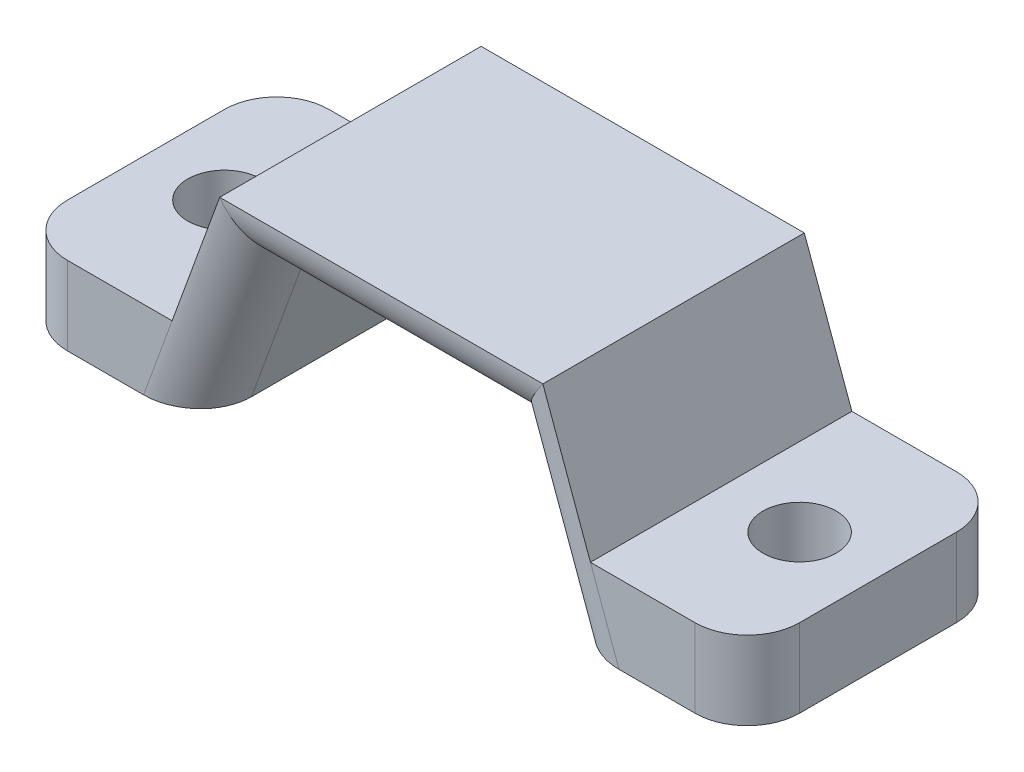
ISO-10303-21;
HEADER;
FILE_DESCRIPTION(('STEP AP214'),'2;1');
FILE_NAME('part.step','',(''),(''),'','','');
FILE_SCHEMA(('AUTOMOTIVE_DESIGN { 1 0 10303 214 1 1 1 1 }'));
ENDSEC;
DATA;
#1=APPLICATION_CONTEXT('core data for automotive mechanical design processes');
#2=APPLICATION_PROTOCOL_DEFINITION('international standard','automotive_design',2000,#1);
#3=PRODUCT_CONTEXT('',#1,'mechanical');
#4=PRODUCT('Part','Part','',(#3));
#5=PRODUCT_RELATED_PRODUCT_CATEGORY('part','',(#4));
#6=PRODUCT_DEFINITION_FORMATION('','',#4);
#7=PRODUCT_DEFINITION_CONTEXT('part definition',#1,'design');
#8=PRODUCT_DEFINITION('design','',#6,#7);
#9=PRODUCT_DEFINITION_SHAPE('','',#8);
#10=(LENGTH_UNIT() NAMED_UNIT(*) SI_UNIT(.MILLI.,.METRE.));
#11=(NAMED_UNIT(*) PLANE_ANGLE_UNIT() SI_UNIT($,.RADIAN.));
#12=(NAMED_UNIT(*) SI_UNIT($,.STERADIAN.) SOLID_ANGLE_UNIT());
#13=UNCERTAINTY_MEASURE_WITH_UNIT(LENGTH_MEASURE(1.E-05),#10,'distance_accuracy_value','');
#14=(GEOMETRIC_REPRESENTATION_CONTEXT(3) GLOBAL_UNCERTAINTY_ASSIGNED_CONTEXT((#13)) GLOBAL_UNIT_ASSIGNED_CONTEXT((#10,
#11,#12)) REPRESENTATION_CONTEXT('',''));
#15=CARTESIAN_POINT('',(0.,0.,0.));
#16=DIRECTION('',(0.,0.,1.));
#17=DIRECTION('',(1.,0.,0.));
#18=AXIS2_PLACEMENT_3D('',#15,#16,#17);
#19=CARTESIAN_POINT('',(0.,0.,5.));
#20=DIRECTION('',(0.,0.,1.));
#21=DIRECTION('',(1.,0.,0.));
#22=AXIS2_PLACEMENT_3D('',#19,#20,#21);
#23=PLANE('',#22);
#24=DIRECTION('',(1.,0.,0.));
#25=VECTOR('',#24,1.);
#26=CARTESIAN_POINT('',(6.96355515784677,0.,5.));
#27=LINE('',#26,#25);
#28=CARTESIAN_POINT('',(9.09191070279859,0.,5.));
#29=VERTEX_POINT('',#28);
#30=CARTESIAN_POINT('',(12.,0.,5.));
#31=VERTEX_POINT('',#30);
#32=EDGE_CURVE('E175',#29,#31,#27,.T.);
#33=ORIENTED_EDGE('',*,*,#32,.T.);
#34=DIRECTION('',(0.,1.,0.));
#35=VECTOR('',#34,1.);
#36=CARTESIAN_POINT('',(12.,3.,5.));
#37=LINE('',#36,#35);
#38=CARTESIAN_POINT('',(12.,3.,5.));
#39=VERTEX_POINT('',#38);
#40=EDGE_CURVE('E171',#31,#39,#37,.T.);
#41=ORIENTED_EDGE('',*,*,#40,.T.);
#42=DIRECTION('',(-1.,0.,0.));
#43=VECTOR('',#42,1.);
#44=CARTESIAN_POINT('',(14.,3.,5.));
#45=LINE('',#44,#43);
#46=CARTESIAN_POINT('',(8.,3.,5.));
#47=VERTEX_POINT('',#46);
#48=EDGE_CURVE('E165',#39,#47,#45,.T.);
#49=ORIENTED_EDGE('',*,*,#48,.T.);
#50=DIRECTION('',(0.342020143325666,-0.93969262078591,0.));
#51=VECTOR('',#50,1.);
#52=CARTESIAN_POINT('',(8.84294039941859,0.684040286651331,5.));
#53=LINE('',#52,#51);
#54=EDGE_CURVE('E168',#47,#29,#53,.T.);
#55=ORIENTED_EDGE('',*,*,#54,.T.);
#56=EDGE_LOOP('',(#33,#41,#49,#55));
#57=FACE_BOUND('',#56,.T.);
#58=ADVANCED_FACE('F39',(#57),#23,.T.);
#59=CARTESIAN_POINT('',(0.,0.,-5.));
#60=DIRECTION('',(0.,0.,1.));
#61=DIRECTION('',(1.,0.,0.));
#62=AXIS2_PLACEMENT_3D('',#59,#60,#61);
#63=PLANE('',#62);
#64=DIRECTION('',(1.,0.,0.));
#65=VECTOR('',#64,1.);
#66=CARTESIAN_POINT('',(-14.,0.,-5.));
#67=LINE('',#66,#65);
#68=CARTESIAN_POINT('',(-12.,0.,-5.));
#69=VERTEX_POINT('',#68);
#70=CARTESIAN_POINT('',(-9.0919107027986,0.,-5.));
#71=VERTEX_POINT('',#70);
#72=EDGE_CURVE('E214',#69,#71,#67,.T.);
#73=ORIENTED_EDGE('',*,*,#72,.F.);
#74=DIRECTION('',(0.,-1.,0.));
#75=VECTOR('',#74,1.);
#76=CARTESIAN_POINT('',(-12.,0.,-5.));
#77=LINE('',#76,#75);
#78=CARTESIAN_POINT('',(-12.,3.,-5.));
#79=VERTEX_POINT('',#78);
#80=EDGE_CURVE('E11',#69,#79,#77,.F.);
#81=ORIENTED_EDGE('',*,*,#80,.T.);
#82=DIRECTION('',(-1.,0.,0.));
#83=VECTOR('',#82,1.);
#84=CARTESIAN_POINT('',(-8.,3.,-5.));
#85=LINE('',#84,#83);
#86=CARTESIAN_POINT('',(-8.,3.,-5.));
#87=VERTEX_POINT('',#86);
#88=EDGE_CURVE('E227',#87,#79,#85,.T.);
#89=ORIENTED_EDGE('',*,*,#88,.F.);
#90=DIRECTION('',(0.342020143325666,0.93969262078591,0.));
#91=VECTOR('',#90,1.);
#92=CARTESIAN_POINT('',(-8.02835918700573,2.92208377406766,-5.));
#93=LINE('',#92,#91);
#94=EDGE_CURVE('E265',#87,#71,#93,.F.);
#95=ORIENTED_EDGE('',*,*,#94,.T.);
#96=EDGE_LOOP('',(#73,#81,#89,#95));
#97=FACE_BOUND('',#96,.T.);
#98=ADVANCED_FACE('F343',(#97),#63,.F.);
#99=CARTESIAN_POINT('',(-14.,3.,5.));
#100=DIRECTION('',(1.,0.,0.));
#101=DIRECTION('',(0.,0.,-1.));
#102=AXIS2_PLACEMENT_3D('',#99,#100,#101);
#103=PLANE('',#102);
#104=DIRECTION('',(0.,0.,-1.));
#105=VECTOR('',#104,1.);
#106=CARTESIAN_POINT('',(-14.,0.,5.));
#107=LINE('',#106,#105);
#108=CARTESIAN_POINT('',(-14.,0.,3.));
#109=VERTEX_POINT('',#108);
#110=CARTESIAN_POINT('',(-14.,0.,-3.));
#111=VERTEX_POINT('',#110);
#112=EDGE_CURVE('E255',#109,#111,#107,.T.);
#113=ORIENTED_EDGE('',*,*,#112,.F.);
#114=DIRECTION('',(0.,-1.,0.));
#115=VECTOR('',#114,1.);
#116=CARTESIAN_POINT('',(-14.,3.,3.));
#117=LINE('',#116,#115);
#118=CARTESIAN_POINT('',(-14.,3.,3.));
#119=VERTEX_POINT('',#118);
#120=EDGE_CURVE('E322',#109,#119,#117,.F.);
#121=ORIENTED_EDGE('',*,*,#120,.T.);
#122=DIRECTION('',(0.,0.,-1.));
#123=VECTOR('',#122,1.);
#124=CARTESIAN_POINT('',(-14.,3.,5.));
#125=LINE('',#124,#123);
#126=CARTESIAN_POINT('',(-14.,3.,-3.));
#127=VERTEX_POINT('',#126);
#128=EDGE_CURVE('E213',#119,#127,#125,.T.);
#129=ORIENTED_EDGE('',*,*,#128,.T.);
#130=DIRECTION('',(0.,-1.,0.));
#131=VECTOR('',#130,1.);
#132=CARTESIAN_POINT('',(-14.,3.,-3.));
#133=LINE('',#132,#131);
#134=EDGE_CURVE('E319',#127,#111,#133,.T.);
#135=ORIENTED_EDGE('',*,*,#134,.T.);
#136=EDGE_LOOP('',(#113,#121,#129,#135));
#137=FACE_BOUND('',#136,.T.);
#138=ADVANCED_FACE('F340',(#137),#103,.F.);
#139=CARTESIAN_POINT('',(-14.,0.,5.));
#140=DIRECTION('',(0.,1.,0.));
#141=DIRECTION('',(-1.,0.,0.));
#142=AXIS2_PLACEMENT_3D('',#139,#140,#141);
#143=PLANE('',#142);
#144=CARTESIAN_POINT('',(-11.,0.,0.));
#145=DIRECTION('',(0.,-1.,0.));
#146=DIRECTION('',(0.,0.,-1.));
#147=AXIS2_PLACEMENT_3D('',#144,#145,#146);
#148=CIRCLE('',#147,1.4);
#149=CARTESIAN_POINT('',(-11.,0.,-1.4));
#150=VERTEX_POINT('',#149);
#151=EDGE_CURVE('E408',#150,#150,#148,.T.);
#152=ORIENTED_EDGE('',*,*,#151,.F.);
#153=EDGE_LOOP('',(#152));
#154=FACE_BOUND('',#153,.T.);
#155=DIRECTION('',(1.,0.,0.));
#156=VECTOR('',#155,1.);
#157=CARTESIAN_POINT('',(-14.,0.,5.));
#158=LINE('',#157,#156);
#159=CARTESIAN_POINT('',(-12.,0.,5.));
#160=VERTEX_POINT('',#159);
#161=CARTESIAN_POINT('',(-9.0919107027986,0.,5.));
#162=VERTEX_POINT('',#161);
#163=EDGE_CURVE('E229',#160,#162,#158,.T.);
#164=ORIENTED_EDGE('',*,*,#163,.F.);
#165=CARTESIAN_POINT('',(-12.,0.,3.));
#166=DIRECTION('',(0.,1.,0.));
#167=DIRECTION('',(-1.,0.,0.));
#168=AXIS2_PLACEMENT_3D('',#165,#166,#167);
#169=CIRCLE('',#168,2.);
#170=EDGE_CURVE('E317',#160,#109,#169,.F.);
#171=ORIENTED_EDGE('',*,*,#170,.T.);
#172=ORIENTED_EDGE('',*,*,#112,.T.);
#173=CARTESIAN_POINT('',(-12.,0.,-3.));
#174=DIRECTION('',(0.,1.,0.));
#175=DIRECTION('',(-1.,0.,0.));
#176=AXIS2_PLACEMENT_3D('',#173,#174,#175);
#177=CIRCLE('',#176,2.);
#178=EDGE_CURVE('E315',#111,#69,#177,.F.);
#179=ORIENTED_EDGE('',*,*,#178,.T.);
#180=ORIENTED_EDGE('',*,*,#72,.T.);
#181=CARTESIAN_POINT('',(-9.0919107027986,0.,-3.));
#182=DIRECTION('',(0.,1.,0.));
#183=DIRECTION('',(1.,0.,0.));
#184=AXIS2_PLACEMENT_3D('',#181,#182,#183);
#185=ELLIPSE('',#184,2.12835554495182,2.);
#186=CARTESIAN_POINT('',(-6.96355515784677,0.,-3.));
#187=VERTEX_POINT('',#186);
#188=EDGE_CURVE('E271',#71,#187,#185,.F.);
#189=ORIENTED_EDGE('',*,*,#188,.T.);
#190=DIRECTION('',(0.,0.,-1.));
#191=VECTOR('',#190,1.);
#192=CARTESIAN_POINT('',(-6.96355515784677,0.,5.));
#193=LINE('',#192,#191);
#194=CARTESIAN_POINT('',(-6.96355515784677,0.,3.));
#195=VERTEX_POINT('',#194);
#196=EDGE_CURVE('E252',#195,#187,#193,.T.);
#197=ORIENTED_EDGE('',*,*,#196,.F.);
#198=CARTESIAN_POINT('',(-9.0919107027986,0.,3.));
#199=DIRECTION('',(0.,1.,0.));
#200=DIRECTION('',(-1.,0.,0.));
#201=AXIS2_PLACEMENT_3D('',#198,#199,#200);
#202=ELLIPSE('',#201,2.12835554495182,2.);
#203=EDGE_CURVE('E268',#195,#162,#202,.F.);
#204=ORIENTED_EDGE('',*,*,#203,.T.);
#205=EDGE_LOOP('',(#164,#171,#172,#179,#180,#189,#197,#204));
#206=FACE_BOUND('',#205,.T.);
#207=ADVANCED_FACE('F338',(#154,#206),#143,.F.);
#208=CARTESIAN_POINT('',(-6.96355515784677,0.,5.));
#209=DIRECTION('',(-0.93969262078591,0.342020143325666,0.));
#210=DIRECTION('',(-0.342020143325666,-0.93969262078591,0.));
#211=AXIS2_PLACEMENT_3D('',#208,#209,#210);
#212=PLANE('',#211);
#213=ORIENTED_EDGE('',*,*,#196,.T.);
#214=DIRECTION('',(0.342020143325666,0.93969262078591,0.));
#215=VECTOR('',#214,1.);
#216=CARTESIAN_POINT('',(-6.96355515784677,0.,-3.));
#217=LINE('',#216,#215);
#218=CARTESIAN_POINT('',(-4.77973375224958,6.,-3.));
#219=VERTEX_POINT('',#218);
#220=EDGE_CURVE('E260',#187,#219,#217,.T.);
#221=ORIENTED_EDGE('',*,*,#220,.T.);
#222=DIRECTION('',(0.,0.,-1.));
#223=VECTOR('',#222,1.);
#224=CARTESIAN_POINT('',(-4.77973375224958,6.,5.));
#225=LINE('',#224,#223);
#226=CARTESIAN_POINT('',(-4.77973375224958,6.,3.));
#227=VERTEX_POINT('',#226);
#228=EDGE_CURVE('E249',#227,#219,#225,.T.);
#229=ORIENTED_EDGE('',*,*,#228,.F.);
#230=DIRECTION('',(0.342020143325666,0.93969262078591,0.));
#231=VECTOR('',#230,1.);
#232=CARTESIAN_POINT('',(-6.96355515784677,0.,3.));
#233=LINE('',#232,#231);
#234=EDGE_CURVE('E258',#227,#195,#233,.F.);
#235=ORIENTED_EDGE('',*,*,#234,.T.);
#236=EDGE_LOOP('',(#213,#221,#229,#235));
#237=FACE_BOUND('',#236,.T.);
#238=ADVANCED_FACE('F353',(#237),#212,.F.);
#239=CARTESIAN_POINT('',(-4.77973375224958,6.,5.));
#240=DIRECTION('',(0.,1.,0.));
#241=DIRECTION('',(0.,0.,1.));
#242=AXIS2_PLACEMENT_3D('',#239,#240,#241);
#243=PLANE('',#242);
#244=ORIENTED_EDGE('',*,*,#228,.T.);
#245=DIRECTION('',(1.,0.,0.));
#246=VECTOR('',#245,1.);
#247=CARTESIAN_POINT('',(-4.77973375224958,6.,-3.));
#248=LINE('',#247,#246);
#249=CARTESIAN_POINT('',(4.77973375224958,6.,-3.));
#250=VERTEX_POINT('',#249);
#251=EDGE_CURVE('E275',#219,#250,#248,.T.);
#252=ORIENTED_EDGE('',*,*,#251,.T.);
#253=DIRECTION('',(0.,0.,-1.));
#254=VECTOR('',#253,1.);
#255=CARTESIAN_POINT('',(4.77973375224958,6.,5.));
#256=LINE('',#255,#254);
#257=CARTESIAN_POINT('',(4.77973375224958,6.,3.));
#258=VERTEX_POINT('',#257);
#259=EDGE_CURVE('E246',#258,#250,#256,.T.);
#260=ORIENTED_EDGE('',*,*,#259,.F.);
#261=DIRECTION('',(1.,0.,0.));
#262=VECTOR('',#261,1.);
#263=CARTESIAN_POINT('',(-4.77973375224958,6.,3.));
#264=LINE('',#263,#262);
#265=EDGE_CURVE('E273',#258,#227,#264,.F.);
#266=ORIENTED_EDGE('',*,*,#265,.T.);
#267=EDGE_LOOP('',(#244,#252,#260,#266));
#268=FACE_BOUND('',#267,.T.);
#269=ADVANCED_FACE('F376',(#268),#243,.F.);
#270=CARTESIAN_POINT('',(4.77973375224958,6.,5.));
#271=DIRECTION('',(0.93969262078591,0.342020143325666,0.));
#272=DIRECTION('',(-0.342020143325666,0.93969262078591,0.));
#273=AXIS2_PLACEMENT_3D('',#270,#271,#272);
#274=PLANE('',#273);
#275=ORIENTED_EDGE('',*,*,#259,.T.);
#276=DIRECTION('',(0.342020143325666,-0.93969262078591,0.));
#277=VECTOR('',#276,1.);
#278=CARTESIAN_POINT('',(4.77973375224958,6.,-3.));
#279=LINE('',#278,#277);
#280=CARTESIAN_POINT('',(6.96355515784677,0.,-3.));
#281=VERTEX_POINT('',#280);
#282=EDGE_CURVE('E279',#250,#281,#279,.T.);
#283=ORIENTED_EDGE('',*,*,#282,.T.);
#284=DIRECTION('',(0.,0.,-1.));
#285=VECTOR('',#284,1.);
#286=CARTESIAN_POINT('',(6.96355515784677,0.,5.));
#287=LINE('',#286,#285);
#288=CARTESIAN_POINT('',(6.96355515784677,0.,3.));
#289=VERTEX_POINT('',#288);
#290=EDGE_CURVE('E243',#289,#281,#287,.T.);
#291=ORIENTED_EDGE('',*,*,#290,.F.);
#292=DIRECTION('',(0.342020143325666,-0.93969262078591,0.));
#293=VECTOR('',#292,1.);
#294=CARTESIAN_POINT('',(4.77973375224958,6.,3.));
#295=LINE('',#294,#293);
#296=EDGE_CURVE('E277',#289,#258,#295,.F.);
#297=ORIENTED_EDGE('',*,*,#296,.T.);
#298=EDGE_LOOP('',(#275,#283,#291,#297));
#299=FACE_BOUND('',#298,.T.);
#300=ADVANCED_FACE('F379',(#299),#274,.F.);
#301=CARTESIAN_POINT('',(6.96355515784677,0.,5.));
#302=DIRECTION('',(0.,1.,0.));
#303=DIRECTION('',(-1.,0.,0.));
#304=AXIS2_PLACEMENT_3D('',#301,#302,#303);
#305=PLANE('',#304);
#306=CARTESIAN_POINT('',(11.,0.,0.));
#307=DIRECTION('',(0.,-1.,0.));
#308=DIRECTION('',(0.,0.,-1.));
#309=AXIS2_PLACEMENT_3D('',#306,#307,#308);
#310=CIRCLE('',#309,1.4);
#311=CARTESIAN_POINT('',(11.,0.,-1.4));
#312=VERTEX_POINT('',#311);
#313=EDGE_CURVE('E405',#312,#312,#310,.T.);
#314=ORIENTED_EDGE('',*,*,#313,.F.);
#315=EDGE_LOOP('',(#314));
#316=FACE_BOUND('',#315,.T.);
#317=DIRECTION('',(0.,0.,-1.));
#318=VECTOR('',#317,1.);
#319=CARTESIAN_POINT('',(14.,0.,5.));
#320=LINE('',#319,#318);
#321=CARTESIAN_POINT('',(14.,0.,3.));
#322=VERTEX_POINT('',#321);
#323=CARTESIAN_POINT('',(14.,0.,-3.));
#324=VERTEX_POINT('',#323);
#325=EDGE_CURVE('E240',#322,#324,#320,.T.);
#326=ORIENTED_EDGE('',*,*,#325,.F.);
#327=CARTESIAN_POINT('',(12.,0.,3.));
#328=DIRECTION('',(0.,1.,0.));
#329=DIRECTION('',(-1.,0.,0.));
#330=AXIS2_PLACEMENT_3D('',#327,#328,#329);
#331=CIRCLE('',#330,2.);
#332=EDGE_CURVE('E308',#322,#31,#331,.F.);
#333=ORIENTED_EDGE('',*,*,#332,.T.);
#334=ORIENTED_EDGE('',*,*,#32,.F.);
#335=CARTESIAN_POINT('',(9.09191070279859,0.,3.));
#336=DIRECTION('',(0.,1.,0.));
#337=DIRECTION('',(-1.,0.,0.));
#338=AXIS2_PLACEMENT_3D('',#335,#336,#337);
#339=ELLIPSE('',#338,2.12835554495182,2.);
#340=EDGE_CURVE('E184',#29,#289,#339,.F.);
#341=ORIENTED_EDGE('',*,*,#340,.T.);
#342=ORIENTED_EDGE('',*,*,#290,.T.);
#343=CARTESIAN_POINT('',(9.09191070279859,0.,-3.));
#344=DIRECTION('',(0.,1.,0.));
#345=DIRECTION('',(1.,0.,0.));
#346=AXIS2_PLACEMENT_3D('',#343,#344,#345);
#347=ELLIPSE('',#346,2.12835554495182,2.);
#348=CARTESIAN_POINT('',(9.09191070279859,0.,-5.));
#349=VERTEX_POINT('',#348);
#350=EDGE_CURVE('E282',#281,#349,#347,.F.);
#351=ORIENTED_EDGE('',*,*,#350,.T.);
#352=DIRECTION('',(1.,0.,0.));
#353=VECTOR('',#352,1.);
#354=CARTESIAN_POINT('',(6.96355515784677,0.,-5.));
#355=LINE('',#354,#353);
#356=CARTESIAN_POINT('',(12.,0.,-5.));
#357=VERTEX_POINT('',#356);
#358=EDGE_CURVE('E216',#349,#357,#355,.T.);
#359=ORIENTED_EDGE('',*,*,#358,.T.);
#360=CARTESIAN_POINT('',(12.,0.,-3.));
#361=DIRECTION('',(0.,1.,0.));
#362=DIRECTION('',(-1.,0.,0.));
#363=AXIS2_PLACEMENT_3D('',#360,#361,#362);
#364=CIRCLE('',#363,2.);
#365=EDGE_CURVE('E306',#357,#324,#364,.F.);
#366=ORIENTED_EDGE('',*,*,#365,.T.);
#367=EDGE_LOOP('',(#326,#333,#334,#341,#342,#351,#359,#366));
#368=FACE_BOUND('',#367,.T.);
#369=ADVANCED_FACE('F388',(#316,#368),#305,.F.);
#370=CARTESIAN_POINT('',(14.,0.,5.));
#371=DIRECTION('',(-1.,0.,0.));
#372=DIRECTION('',(0.,0.,1.));
#373=AXIS2_PLACEMENT_3D('',#370,#371,#372);
#374=PLANE('',#373);
#375=DIRECTION('',(0.,0.,-1.));
#376=VECTOR('',#375,1.);
#377=CARTESIAN_POINT('',(14.,3.,5.));
#378=LINE('',#377,#376);
#379=CARTESIAN_POINT('',(14.,3.,3.));
#380=VERTEX_POINT('',#379);
#381=CARTESIAN_POINT('',(14.,3.,-3.));
#382=VERTEX_POINT('',#381);
#383=EDGE_CURVE('E195',#380,#382,#378,.T.);
#384=ORIENTED_EDGE('',*,*,#383,.F.);
#385=DIRECTION('',(0.,1.,0.));
#386=VECTOR('',#385,1.);
#387=CARTESIAN_POINT('',(14.,0.,3.));
#388=LINE('',#387,#386);
#389=EDGE_CURVE('E304',#380,#322,#388,.F.);
#390=ORIENTED_EDGE('',*,*,#389,.T.);
#391=ORIENTED_EDGE('',*,*,#325,.T.);
#392=DIRECTION('',(0.,1.,0.));
#393=VECTOR('',#392,1.);
#394=CARTESIAN_POINT('',(14.,0.,-3.));
#395=LINE('',#394,#393);
#396=EDGE_CURVE('E301',#324,#382,#395,.T.);
#397=ORIENTED_EDGE('',*,*,#396,.T.);
#398=EDGE_LOOP('',(#384,#390,#391,#397));
#399=FACE_BOUND('',#398,.T.);
#400=ADVANCED_FACE('F399',(#399),#374,.F.);
#401=CARTESIAN_POINT('',(14.,3.,5.));
#402=DIRECTION('',(0.,-1.,0.));
#403=DIRECTION('',(1.,0.,0.));
#404=AXIS2_PLACEMENT_3D('',#401,#402,#403);
#405=PLANE('',#404);
#406=CARTESIAN_POINT('',(11.,3.,0.));
#407=DIRECTION('',(0.,-1.,0.));
#408=DIRECTION('',(1.,0.,0.));
#409=AXIS2_PLACEMENT_3D('',#406,#407,#408);
#410=CIRCLE('',#409,1.4);
#411=CARTESIAN_POINT('',(12.4,3.,0.));
#412=VERTEX_POINT('',#411);
#413=EDGE_CURVE('E291',#412,#412,#410,.F.);
#414=ORIENTED_EDGE('',*,*,#413,.F.);
#415=EDGE_LOOP('',(#414));
#416=FACE_BOUND('',#415,.T.);
#417=ORIENTED_EDGE('',*,*,#48,.F.);
#418=CARTESIAN_POINT('',(12.,3.,3.));
#419=DIRECTION('',(0.,-1.,0.));
#420=DIRECTION('',(1.,0.,0.));
#421=AXIS2_PLACEMENT_3D('',#418,#419,#420);
#422=CIRCLE('',#421,2.);
#423=EDGE_CURVE('E299',#39,#380,#422,.F.);
#424=ORIENTED_EDGE('',*,*,#423,.T.);
#425=ORIENTED_EDGE('',*,*,#383,.T.);
#426=CARTESIAN_POINT('',(12.,3.,-3.));
#427=DIRECTION('',(0.,-1.,0.));
#428=DIRECTION('',(1.,0.,0.));
#429=AXIS2_PLACEMENT_3D('',#426,#427,#428);
#430=CIRCLE('',#429,2.);
#431=CARTESIAN_POINT('',(12.,3.,-5.));
#432=VERTEX_POINT('',#431);
#433=EDGE_CURVE('E297',#382,#432,#430,.F.);
#434=ORIENTED_EDGE('',*,*,#433,.T.);
#435=DIRECTION('',(-1.,0.,0.));
#436=VECTOR('',#435,1.);
#437=CARTESIAN_POINT('',(14.,3.,-5.));
#438=LINE('',#437,#436);
#439=CARTESIAN_POINT('',(8.,3.,-5.));
#440=VERTEX_POINT('',#439);
#441=EDGE_CURVE('E191',#432,#440,#438,.T.);
#442=ORIENTED_EDGE('',*,*,#441,.T.);
#443=DIRECTION('',(0.,0.,-1.));
#444=VECTOR('',#443,1.);
#445=CARTESIAN_POINT('',(8.,3.,5.));
#446=LINE('',#445,#444);
#447=EDGE_CURVE('E188',#47,#440,#446,.T.);
#448=ORIENTED_EDGE('',*,*,#447,.F.);
#449=EDGE_LOOP('',(#417,#424,#425,#434,#442,#448));
#450=FACE_BOUND('',#449,.T.);
#451=ADVANCED_FACE('F189',(#416,#450),#405,.F.);
#452=CARTESIAN_POINT('',(8.,3.,5.));
#453=DIRECTION('',(-0.93969262078591,-0.342020143325666,0.));
#454=DIRECTION('',(0.342020143325666,-0.93969262078591,0.));
#455=AXIS2_PLACEMENT_3D('',#452,#453,#454);
#456=PLANE('',#455);
#457=DIRECTION('',(-0.342020143325666,0.93969262078591,0.));
#458=VECTOR('',#457,1.);
#459=CARTESIAN_POINT('',(8.,3.,-5.));
#460=LINE('',#459,#458);
#461=CARTESIAN_POINT('',(6.18014882866901,8.,-5.));
#462=VERTEX_POINT('',#461);
#463=EDGE_CURVE('E221',#440,#462,#460,.T.);
#464=ORIENTED_EDGE('',*,*,#463,.T.);
#465=DIRECTION('',(0.,0.,-1.));
#466=VECTOR('',#465,1.);
#467=CARTESIAN_POINT('',(6.18014882866901,8.,5.));
#468=LINE('',#467,#466);
#469=CARTESIAN_POINT('',(6.18014882866901,8.,5.));
#470=VERTEX_POINT('',#469);
#471=EDGE_CURVE('E196',#470,#462,#468,.T.);
#472=ORIENTED_EDGE('',*,*,#471,.F.);
#473=DIRECTION('',(-0.342020143325666,0.93969262078591,0.));
#474=VECTOR('',#473,1.);
#475=CARTESIAN_POINT('',(8.,3.,5.));
#476=LINE('',#475,#474);
#477=EDGE_CURVE('E174',#47,#470,#476,.T.);
#478=ORIENTED_EDGE('',*,*,#477,.F.);
#479=ORIENTED_EDGE('',*,*,#447,.T.);
#480=EDGE_LOOP('',(#464,#472,#478,#479));
#481=FACE_BOUND('',#480,.T.);
#482=ADVANCED_FACE('F198',(#481),#456,.F.);
#483=CARTESIAN_POINT('',(6.18014882866901,8.,5.));
#484=DIRECTION('',(0.,-1.,0.));
#485=DIRECTION('',(0.,0.,-1.));
#486=AXIS2_PLACEMENT_3D('',#483,#484,#485);
#487=PLANE('',#486);
#488=DIRECTION('',(-1.,0.,0.));
#489=VECTOR('',#488,1.);
#490=CARTESIAN_POINT('',(6.18014882866901,8.,-5.));
#491=LINE('',#490,#489);
#492=CARTESIAN_POINT('',(-6.18014882866901,8.,-5.));
#493=VERTEX_POINT('',#492);
#494=EDGE_CURVE('E223',#462,#493,#491,.T.);
#495=ORIENTED_EDGE('',*,*,#494,.T.);
#496=DIRECTION('',(0.,0.,-1.));
#497=VECTOR('',#496,1.);
#498=CARTESIAN_POINT('',(-6.18014882866901,8.,5.));
#499=LINE('',#498,#497);
#500=CARTESIAN_POINT('',(-6.18014882866901,8.,5.));
#501=VERTEX_POINT('',#500);
#502=EDGE_CURVE('E234',#501,#493,#499,.T.);
#503=ORIENTED_EDGE('',*,*,#502,.F.);
#504=DIRECTION('',(-1.,0.,0.));
#505=VECTOR('',#504,1.);
#506=CARTESIAN_POINT('',(6.18014882866901,8.,5.));
#507=LINE('',#506,#505);
#508=EDGE_CURVE('E201',#470,#501,#507,.T.);
#509=ORIENTED_EDGE('',*,*,#508,.F.);
#510=ORIENTED_EDGE('',*,*,#471,.T.);
#511=EDGE_LOOP('',(#495,#503,#509,#510));
#512=FACE_BOUND('',#511,.T.);
#513=ADVANCED_FACE('F364',(#512),#487,.F.);
#514=CARTESIAN_POINT('',(-6.18014882866901,8.,5.));
#515=DIRECTION('',(0.93969262078591,-0.342020143325666,0.));
#516=DIRECTION('',(0.342020143325666,0.93969262078591,0.));
#517=AXIS2_PLACEMENT_3D('',#514,#515,#516);
#518=PLANE('',#517);
#519=DIRECTION('',(-0.342020143325666,-0.93969262078591,0.));
#520=VECTOR('',#519,1.);
#521=CARTESIAN_POINT('',(-6.18014882866901,8.,-5.));
#522=LINE('',#521,#520);
#523=EDGE_CURVE('E225',#493,#87,#522,.T.);
#524=ORIENTED_EDGE('',*,*,#523,.T.);
#525=DIRECTION('',(0.,0.,-1.));
#526=VECTOR('',#525,1.);
#527=CARTESIAN_POINT('',(-8.,3.,5.));
#528=LINE('',#527,#526);
#529=CARTESIAN_POINT('',(-8.,3.,5.));
#530=VERTEX_POINT('',#529);
#531=EDGE_CURVE('E231',#530,#87,#528,.T.);
#532=ORIENTED_EDGE('',*,*,#531,.F.);
#533=DIRECTION('',(-0.342020143325666,-0.93969262078591,0.));
#534=VECTOR('',#533,1.);
#535=CARTESIAN_POINT('',(-6.18014882866901,8.,5.));
#536=LINE('',#535,#534);
#537=EDGE_CURVE('E204',#501,#530,#536,.T.);
#538=ORIENTED_EDGE('',*,*,#537,.F.);
#539=ORIENTED_EDGE('',*,*,#502,.T.);
#540=EDGE_LOOP('',(#524,#532,#538,#539));
#541=FACE_BOUND('',#540,.T.);
#542=ADVANCED_FACE('F369',(#541),#518,.F.);
#543=CARTESIAN_POINT('',(-8.,3.,5.));
#544=DIRECTION('',(0.,-1.,0.));
#545=DIRECTION('',(1.,0.,0.));
#546=AXIS2_PLACEMENT_3D('',#543,#544,#545);
#547=PLANE('',#546);
#548=CARTESIAN_POINT('',(-11.,3.,0.));
#549=DIRECTION('',(0.,-1.,0.));
#550=DIRECTION('',(1.,0.,0.));
#551=AXIS2_PLACEMENT_3D('',#548,#549,#550);
#552=CIRCLE('',#551,1.4);
#553=CARTESIAN_POINT('',(-9.6,3.,0.));
#554=VERTEX_POINT('',#553);
#555=EDGE_CURVE('E217',#554,#554,#552,.F.);
#556=ORIENTED_EDGE('',*,*,#555,.F.);
#557=EDGE_LOOP('',(#556));
#558=FACE_BOUND('',#557,.T.);
#559=ORIENTED_EDGE('',*,*,#128,.F.);
#560=CARTESIAN_POINT('',(-12.,3.,3.));
#561=DIRECTION('',(0.,-1.,0.));
#562=DIRECTION('',(1.,0.,0.));
#563=AXIS2_PLACEMENT_3D('',#560,#561,#562);
#564=CIRCLE('',#563,2.);
#565=CARTESIAN_POINT('',(-12.,3.,5.));
#566=VERTEX_POINT('',#565);
#567=EDGE_CURVE('E47',#119,#566,#564,.F.);
#568=ORIENTED_EDGE('',*,*,#567,.T.);
#569=DIRECTION('',(-1.,0.,0.));
#570=VECTOR('',#569,1.);
#571=CARTESIAN_POINT('',(-8.,3.,5.));
#572=LINE('',#571,#570);
#573=EDGE_CURVE('E210',#530,#566,#572,.T.);
#574=ORIENTED_EDGE('',*,*,#573,.F.);
#575=ORIENTED_EDGE('',*,*,#531,.T.);
#576=ORIENTED_EDGE('',*,*,#88,.T.);
#577=CARTESIAN_POINT('',(-12.,3.,-3.));
#578=DIRECTION('',(0.,-1.,0.));
#579=DIRECTION('',(1.,0.,0.));
#580=AXIS2_PLACEMENT_3D('',#577,#578,#579);
#581=CIRCLE('',#580,2.);
#582=EDGE_CURVE('E59',#79,#127,#581,.F.);
#583=ORIENTED_EDGE('',*,*,#582,.T.);
#584=EDGE_LOOP('',(#559,#568,#574,#575,#576,#583));
#585=FACE_BOUND('',#584,.T.);
#586=ADVANCED_FACE('F326',(#558,#585),#547,.F.);
#587=ORIENTED_EDGE('',*,*,#573,.T.);
#588=DIRECTION('',(0.,-1.,0.));
#589=VECTOR('',#588,1.);
#590=CARTESIAN_POINT('',(-12.,0.,5.));
#591=LINE('',#590,#589);
#592=EDGE_CURVE('E312',#566,#160,#591,.T.);
#593=ORIENTED_EDGE('',*,*,#592,.T.);
#594=ORIENTED_EDGE('',*,*,#163,.T.);
#595=DIRECTION('',(0.342020143325666,0.93969262078591,0.));
#596=VECTOR('',#595,1.);
#597=CARTESIAN_POINT('',(-6.6591189938214,6.68404028665133,5.));
#598=LINE('',#597,#596);
#599=EDGE_CURVE('E185',#162,#530,#598,.T.);
#600=ORIENTED_EDGE('',*,*,#599,.T.);
#601=EDGE_LOOP('',(#587,#593,#594,#600));
#602=FACE_BOUND('',#601,.T.);
#603=ADVANCED_FACE('F331',(#602),#23,.T.);
#604=ORIENTED_EDGE('',*,*,#441,.F.);
#605=DIRECTION('',(0.,1.,0.));
#606=VECTOR('',#605,1.);
#607=CARTESIAN_POINT('',(12.,0.,-5.));
#608=LINE('',#607,#606);
#609=EDGE_CURVE('E310',#432,#357,#608,.F.);
#610=ORIENTED_EDGE('',*,*,#609,.T.);
#611=ORIENTED_EDGE('',*,*,#358,.F.);
#612=DIRECTION('',(0.342020143325666,-0.93969262078591,0.));
#613=VECTOR('',#612,1.);
#614=CARTESIAN_POINT('',(8.02835918700573,2.92208377406766,-5.));
#615=LINE('',#614,#613);
#616=EDGE_CURVE('E263',#349,#440,#615,.F.);
#617=ORIENTED_EDGE('',*,*,#616,.T.);
#618=EDGE_LOOP('',(#604,#610,#611,#617));
#619=FACE_BOUND('',#618,.T.);
#620=ADVANCED_FACE('F391',(#619),#63,.F.);
#621=CARTESIAN_POINT('',(-11.,8.001,0.));
#622=DIRECTION('',(0.,-1.,0.));
#623=DIRECTION('',(0.,0.,-1.));
#624=AXIS2_PLACEMENT_3D('',#621,#622,#623);
#625=CYLINDRICAL_SURFACE('',#624,1.4);
#626=ORIENTED_EDGE('',*,*,#151,.T.);
#627=EDGE_LOOP('',(#626));
#628=FACE_BOUND('',#627,.T.);
#629=ORIENTED_EDGE('',*,*,#555,.T.);
#630=EDGE_LOOP('',(#629));
#631=FACE_BOUND('',#630,.T.);
#632=ADVANCED_FACE('F416',(#628,#631),#625,.F.);
#633=CARTESIAN_POINT('',(11.,8.001,0.));
#634=DIRECTION('',(0.,-1.,0.));
#635=DIRECTION('',(0.,0.,-1.));
#636=AXIS2_PLACEMENT_3D('',#633,#634,#635);
#637=CYLINDRICAL_SURFACE('',#636,1.4);
#638=ORIENTED_EDGE('',*,*,#313,.T.);
#639=EDGE_LOOP('',(#638));
#640=FACE_BOUND('',#639,.T.);
#641=ORIENTED_EDGE('',*,*,#413,.T.);
#642=EDGE_LOOP('',(#641));
#643=FACE_BOUND('',#642,.T.);
#644=ADVANCED_FACE('F497',(#640,#643),#637,.F.);
#645=CARTESIAN_POINT('',(6.6591189938214,6.68404028665133,-3.));
#646=DIRECTION('',(0.342020143325666,-0.93969262078591,0.));
#647=DIRECTION('',(0.93969262078591,0.342020143325666,0.));
#648=AXIS2_PLACEMENT_3D('',#645,#646,#647);
#649=CYLINDRICAL_SURFACE('',#648,2.);
#650=ORIENTED_EDGE('',*,*,#350,.F.);
#651=ORIENTED_EDGE('',*,*,#282,.F.);
#652=CARTESIAN_POINT('',(6.18014882866901,8.,-3.));
#653=DIRECTION('',(0.819152044288991,-0.573576436351047,0.));
#654=DIRECTION('',(0.573576436351047,0.819152044288991,0.));
#655=AXIS2_PLACEMENT_3D('',#652,#653,#654);
#656=ELLIPSE('',#655,2.44154917752292,2.);
#657=EDGE_CURVE('E287',#462,#250,#656,.F.);
#658=ORIENTED_EDGE('',*,*,#657,.F.);
#659=ORIENTED_EDGE('',*,*,#463,.F.);
#660=ORIENTED_EDGE('',*,*,#616,.F.);
#661=EDGE_LOOP('',(#650,#651,#658,#659,#660));
#662=FACE_BOUND('',#661,.T.);
#663=ADVANCED_FACE('F383',(#662),#649,.T.);
#664=CARTESIAN_POINT('',(-4.77973375224958,8.,-3.));
#665=DIRECTION('',(1.,0.,0.));
#666=DIRECTION('',(0.,0.,-1.));
#667=AXIS2_PLACEMENT_3D('',#664,#665,#666);
#668=CYLINDRICAL_SURFACE('',#667,2.);
#669=ORIENTED_EDGE('',*,*,#657,.T.);
#670=ORIENTED_EDGE('',*,*,#251,.F.);
#671=CARTESIAN_POINT('',(-6.18014882866901,8.,-3.));
#672=DIRECTION('',(0.819152044288991,0.573576436351047,0.));
#673=DIRECTION('',(-0.573576436351047,0.819152044288991,0.));
#674=AXIS2_PLACEMENT_3D('',#671,#672,#673);
#675=ELLIPSE('',#674,2.44154917752292,2.);
#676=EDGE_CURVE('E285',#493,#219,#675,.F.);
#677=ORIENTED_EDGE('',*,*,#676,.F.);
#678=ORIENTED_EDGE('',*,*,#494,.F.);
#679=EDGE_LOOP('',(#669,#670,#677,#678));
#680=FACE_BOUND('',#679,.T.);
#681=ADVANCED_FACE('F373',(#680),#668,.T.);
#682=CARTESIAN_POINT('',(-8.84294039941859,0.684040286651331,-3.));
#683=DIRECTION('',(0.342020143325666,0.93969262078591,0.));
#684=DIRECTION('',(-0.93969262078591,0.342020143325666,0.));
#685=AXIS2_PLACEMENT_3D('',#682,#683,#684);
#686=CYLINDRICAL_SURFACE('',#685,2.);
#687=ORIENTED_EDGE('',*,*,#94,.F.);
#688=ORIENTED_EDGE('',*,*,#523,.F.);
#689=ORIENTED_EDGE('',*,*,#676,.T.);
#690=ORIENTED_EDGE('',*,*,#220,.F.);
#691=ORIENTED_EDGE('',*,*,#188,.F.);
#692=EDGE_LOOP('',(#687,#688,#689,#690,#691));
#693=FACE_BOUND('',#692,.T.);
#694=ADVANCED_FACE('F349',(#693),#686,.T.);
#695=CARTESIAN_POINT('',(-8.02835918700573,2.92208377406766,3.));
#696=DIRECTION('',(-0.342020143325666,-0.93969262078591,0.));
#697=DIRECTION('',(0.93969262078591,-0.342020143325666,0.));
#698=AXIS2_PLACEMENT_3D('',#695,#696,#697);
#699=CYLINDRICAL_SURFACE('',#698,2.);
#700=ORIENTED_EDGE('',*,*,#203,.F.);
#701=ORIENTED_EDGE('',*,*,#234,.F.);
#702=CARTESIAN_POINT('',(-6.18014882866901,8.,3.));
#703=DIRECTION('',(-0.819152044288991,-0.573576436351047,0.));
#704=DIRECTION('',(0.573576436351047,-0.819152044288991,0.));
#705=AXIS2_PLACEMENT_3D('',#702,#703,#704);
#706=ELLIPSE('',#705,2.44154917752292,2.);
#707=EDGE_CURVE('E288',#501,#227,#706,.F.);
#708=ORIENTED_EDGE('',*,*,#707,.F.);
#709=ORIENTED_EDGE('',*,*,#537,.T.);
#710=ORIENTED_EDGE('',*,*,#599,.F.);
#711=EDGE_LOOP('',(#700,#701,#708,#709,#710));
#712=FACE_BOUND('',#711,.T.);
#713=ADVANCED_FACE('F358',(#712),#699,.T.);
#714=CARTESIAN_POINT('',(0.,8.,3.));
#715=DIRECTION('',(-1.,0.,0.));
#716=DIRECTION('',(0.,0.,1.));
#717=AXIS2_PLACEMENT_3D('',#714,#715,#716);
#718=CYLINDRICAL_SURFACE('',#717,2.);
#719=ORIENTED_EDGE('',*,*,#707,.T.);
#720=ORIENTED_EDGE('',*,*,#265,.F.);
#721=CARTESIAN_POINT('',(6.18014882866901,8.,3.));
#722=DIRECTION('',(-0.819152044288991,0.573576436351047,0.));
#723=DIRECTION('',(0.573576436351047,0.819152044288991,0.));
#724=AXIS2_PLACEMENT_3D('',#721,#722,#723);
#725=ELLIPSE('',#724,2.44154917752292,2.);
#726=EDGE_CURVE('E292',#470,#258,#725,.F.);
#727=ORIENTED_EDGE('',*,*,#726,.F.);
#728=ORIENTED_EDGE('',*,*,#508,.T.);
#729=EDGE_LOOP('',(#719,#720,#727,#728));
#730=FACE_BOUND('',#729,.T.);
#731=ADVANCED_FACE('F361',(#730),#718,.T.);
#732=CARTESIAN_POINT('',(8.02835918700573,2.92208377406766,3.));
#733=DIRECTION('',(-0.342020143325666,0.93969262078591,0.));
#734=DIRECTION('',(-0.93969262078591,-0.342020143325666,0.));
#735=AXIS2_PLACEMENT_3D('',#732,#733,#734);
#736=CYLINDRICAL_SURFACE('',#735,2.);
#737=ORIENTED_EDGE('',*,*,#726,.T.);
#738=ORIENTED_EDGE('',*,*,#296,.F.);
#739=ORIENTED_EDGE('',*,*,#340,.F.);
#740=ORIENTED_EDGE('',*,*,#54,.F.);
#741=ORIENTED_EDGE('',*,*,#477,.T.);
#742=EDGE_LOOP('',(#737,#738,#739,#740,#741));
#743=FACE_BOUND('',#742,.T.);
#744=ADVANCED_FACE('F181',(#743),#736,.T.);
#745=CARTESIAN_POINT('',(12.,0.,3.));
#746=DIRECTION('',(0.,-1.,0.));
#747=DIRECTION('',(0.,0.,-1.));
#748=AXIS2_PLACEMENT_3D('',#745,#746,#747);
#749=CYLINDRICAL_SURFACE('',#748,2.);
#750=ORIENTED_EDGE('',*,*,#332,.F.);
#751=ORIENTED_EDGE('',*,*,#389,.F.);
#752=ORIENTED_EDGE('',*,*,#423,.F.);
#753=ORIENTED_EDGE('',*,*,#40,.F.);
#754=EDGE_LOOP('',(#750,#751,#752,#753));
#755=FACE_BOUND('',#754,.T.);
#756=ADVANCED_FACE('F402',(#755),#749,.T.);
#757=CARTESIAN_POINT('',(12.,0.,-3.));
#758=DIRECTION('',(0.,1.,0.));
#759=DIRECTION('',(0.,0.,1.));
#760=AXIS2_PLACEMENT_3D('',#757,#758,#759);
#761=CYLINDRICAL_SURFACE('',#760,2.);
#762=ORIENTED_EDGE('',*,*,#365,.F.);
#763=ORIENTED_EDGE('',*,*,#609,.F.);
#764=ORIENTED_EDGE('',*,*,#433,.F.);
#765=ORIENTED_EDGE('',*,*,#396,.F.);
#766=EDGE_LOOP('',(#762,#763,#764,#765));
#767=FACE_BOUND('',#766,.T.);
#768=ADVANCED_FACE('F394',(#767),#761,.T.);
#769=CARTESIAN_POINT('',(-12.,0.,3.));
#770=DIRECTION('',(0.,1.,0.));
#771=DIRECTION('',(0.,0.,1.));
#772=AXIS2_PLACEMENT_3D('',#769,#770,#771);
#773=CYLINDRICAL_SURFACE('',#772,2.);
#774=ORIENTED_EDGE('',*,*,#567,.F.);
#775=ORIENTED_EDGE('',*,*,#120,.F.);
#776=ORIENTED_EDGE('',*,*,#170,.F.);
#777=ORIENTED_EDGE('',*,*,#592,.F.);
#778=EDGE_LOOP('',(#774,#775,#776,#777));
#779=FACE_BOUND('',#778,.T.);
#780=ADVANCED_FACE('F335',(#779),#773,.T.);
#781=CARTESIAN_POINT('',(-12.,3.,-3.));
#782=DIRECTION('',(0.,-1.,0.));
#783=DIRECTION('',(0.,0.,-1.));
#784=AXIS2_PLACEMENT_3D('',#781,#782,#783);
#785=CYLINDRICAL_SURFACE('',#784,2.);
#786=ORIENTED_EDGE('',*,*,#582,.F.);
#787=ORIENTED_EDGE('',*,*,#80,.F.);
#788=ORIENTED_EDGE('',*,*,#178,.F.);
#789=ORIENTED_EDGE('',*,*,#134,.F.);
#790=EDGE_LOOP('',(#786,#787,#788,#789));
#791=FACE_BOUND('',#790,.T.);
#792=ADVANCED_FACE('F41',(#791),#785,.T.);
#793=CLOSED_SHELL('',(#58,#98,#138,#207,#238,#269,#300,#369,#400,#451,#482,#513,#542,#586,#603,
#620,#632,#644,#663,#681,#694,#713,#731,#744,#756,#768,#780,#792));
#794=MANIFOLD_SOLID_BREP('B2',#793);
#795=ADVANCED_BREP_SHAPE_REPRESENTATION('',(#18,#794),#14);
#796=SHAPE_DEFINITION_REPRESENTATION(#9,#795);
ENDSEC;
END-ISO-10303-21;
